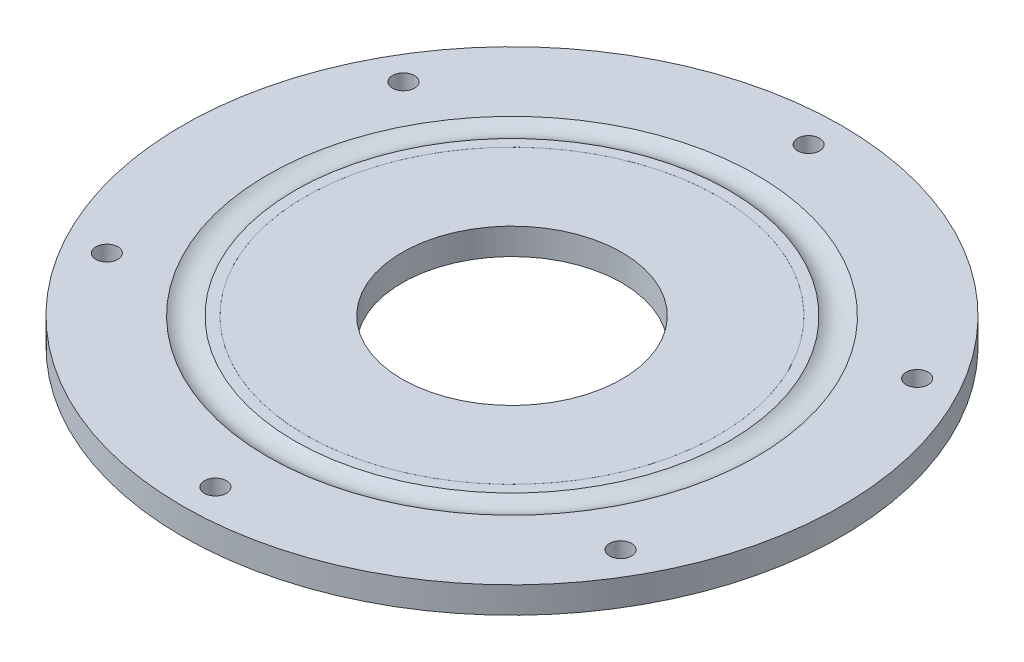
ISO-10303-21;
HEADER;
FILE_DESCRIPTION(('STEP AP214'),'2;1');
FILE_NAME('part.step','',(''),(''),'','','');
FILE_SCHEMA(('AUTOMOTIVE_DESIGN { 1 0 10303 214 1 1 1 1 }'));
ENDSEC;
DATA;
#1=APPLICATION_CONTEXT('core data for automotive mechanical design processes');
#2=APPLICATION_PROTOCOL_DEFINITION('international standard','automotive_design',2000,#1);
#3=PRODUCT_CONTEXT('',#1,'mechanical');
#4=PRODUCT('Part','Part','',(#3));
#5=PRODUCT_RELATED_PRODUCT_CATEGORY('part','',(#4));
#6=PRODUCT_DEFINITION_FORMATION('','',#4);
#7=PRODUCT_DEFINITION_CONTEXT('part definition',#1,'design');
#8=PRODUCT_DEFINITION('design','',#6,#7);
#9=PRODUCT_DEFINITION_SHAPE('','',#8);
#10=(LENGTH_UNIT() NAMED_UNIT(*) SI_UNIT(.MILLI.,.METRE.));
#11=(NAMED_UNIT(*) PLANE_ANGLE_UNIT() SI_UNIT($,.RADIAN.));
#12=(NAMED_UNIT(*) SI_UNIT($,.STERADIAN.) SOLID_ANGLE_UNIT());
#13=UNCERTAINTY_MEASURE_WITH_UNIT(LENGTH_MEASURE(1.E-05),#10,'distance_accuracy_value','');
#14=(GEOMETRIC_REPRESENTATION_CONTEXT(3) GLOBAL_UNCERTAINTY_ASSIGNED_CONTEXT((#13)) GLOBAL_UNIT_ASSIGNED_CONTEXT((#10,
#11,#12)) REPRESENTATION_CONTEXT('',''));
#15=CARTESIAN_POINT('',(0.,0.,0.));
#16=DIRECTION('',(0.,0.,1.));
#17=DIRECTION('',(1.,0.,0.));
#18=AXIS2_PLACEMENT_3D('',#15,#16,#17);
#19=CARTESIAN_POINT('',(59.,0.8724,0.));
#20=DIRECTION('',(0.,-1.,0.));
#21=DIRECTION('',(0.,0.,-1.));
#22=AXIS2_PLACEMENT_3D('',#19,#20,#21);
#23=PLANE('',#22);
#24=CARTESIAN_POINT('',(0.,0.8724,67.5));
#25=DIRECTION('',(0.,-1.,0.));
#26=DIRECTION('',(0.,0.,-1.));
#27=AXIS2_PLACEMENT_3D('',#24,#25,#26);
#28=CIRCLE('',#27,2.5);
#29=CARTESIAN_POINT('',(0.,0.8724,65.));
#30=VERTEX_POINT('',#29);
#31=EDGE_CURVE('E79',#30,#30,#28,.T.);
#32=ORIENTED_EDGE('',*,*,#31,.F.);
#33=EDGE_LOOP('',(#32));
#34=FACE_BOUND('',#33,.T.);
#35=CARTESIAN_POINT('',(-58.4567147554482,0.8724,33.7499999999975));
#36=DIRECTION('',(0.,-1.,0.));
#37=DIRECTION('',(0.,0.,-1.));
#38=AXIS2_PLACEMENT_3D('',#35,#36,#37);
#39=CIRCLE('',#38,2.50000000000347);
#40=CARTESIAN_POINT('',(-58.4567147554482,0.8724,31.249999999994));
#41=VERTEX_POINT('',#40);
#42=EDGE_CURVE('E139',#41,#41,#39,.T.);
#43=ORIENTED_EDGE('',*,*,#42,.F.);
#44=EDGE_LOOP('',(#43));
#45=FACE_BOUND('',#44,.T.);
#46=CARTESIAN_POINT('',(-58.4567147554453,0.8724,-33.7500000000025));
#47=DIRECTION('',(0.,-1.,0.));
#48=DIRECTION('',(0.,0.,-1.));
#49=AXIS2_PLACEMENT_3D('',#46,#47,#48);
#50=CIRCLE('',#49,2.50000000000682);
#51=CARTESIAN_POINT('',(-58.4567147554453,0.8724,-36.2500000000093));
#52=VERTEX_POINT('',#51);
#53=EDGE_CURVE('E143',#52,#52,#50,.T.);
#54=ORIENTED_EDGE('',*,*,#53,.F.);
#55=EDGE_LOOP('',(#54));
#56=FACE_BOUND('',#55,.T.);
#57=CARTESIAN_POINT('',(5.73059706197408E-12,0.8724,-67.5));
#58=DIRECTION('',(0.,-1.,0.));
#59=DIRECTION('',(0.,0.,-1.));
#60=AXIS2_PLACEMENT_3D('',#57,#58,#59);
#61=CIRCLE('',#60,2.50000000000717);
#62=CARTESIAN_POINT('',(5.73059706197408E-12,0.8724,-70.0000000000072));
#63=VERTEX_POINT('',#62);
#64=EDGE_CURVE('E147',#63,#63,#61,.T.);
#65=ORIENTED_EDGE('',*,*,#64,.F.);
#66=EDGE_LOOP('',(#65));
#67=FACE_BOUND('',#66,.T.);
#68=CARTESIAN_POINT('',(58.4567147554539,0.8724,-33.7499999999975));
#69=DIRECTION('',(0.,-1.,0.));
#70=DIRECTION('',(0.,0.,-1.));
#71=AXIS2_PLACEMENT_3D('',#68,#69,#70);
#72=CIRCLE('',#71,2.50000000000482);
#73=CARTESIAN_POINT('',(58.4567147554539,0.8724,-36.2500000000023));
#74=VERTEX_POINT('',#73);
#75=EDGE_CURVE('E151',#74,#74,#72,.T.);
#76=ORIENTED_EDGE('',*,*,#75,.F.);
#77=EDGE_LOOP('',(#76));
#78=FACE_BOUND('',#77,.T.);
#79=CARTESIAN_POINT('',(58.456714755451,0.8724,33.7500000000025));
#80=DIRECTION('',(0.,-1.,0.));
#81=DIRECTION('',(0.,0.,-1.));
#82=AXIS2_PLACEMENT_3D('',#79,#80,#81);
#83=CIRCLE('',#82,2.50000000000182);
#84=CARTESIAN_POINT('',(58.456714755451,0.8724,31.2500000000007));
#85=VERTEX_POINT('',#84);
#86=EDGE_CURVE('E155',#85,#85,#83,.T.);
#87=ORIENTED_EDGE('',*,*,#86,.F.);
#88=EDGE_LOOP('',(#87));
#89=FACE_BOUND('',#88,.T.);
#90=CARTESIAN_POINT('',(0.,0.8724,0.));
#91=DIRECTION('',(0.,1.,0.));
#92=DIRECTION('',(0.,0.,1.));
#93=AXIS2_PLACEMENT_3D('',#90,#91,#92);
#94=CIRCLE('',#93,47.);
#95=CARTESIAN_POINT('',(0.,0.8724,47.));
#96=VERTEX_POINT('',#95);
#97=EDGE_CURVE('E51',#96,#96,#94,.T.);
#98=ORIENTED_EDGE('',*,*,#97,.T.);
#99=EDGE_LOOP('',(#98));
#100=FACE_BOUND('',#99,.T.);
#101=CARTESIAN_POINT('',(0.,0.8724,0.));
#102=DIRECTION('',(0.,-1.,0.));
#103=DIRECTION('',(0.,0.,-1.));
#104=AXIS2_PLACEMENT_3D('',#101,#102,#103);
#105=CIRCLE('',#104,75.);
#106=CARTESIAN_POINT('',(0.,0.8724,-75.));
#107=VERTEX_POINT('',#106);
#108=EDGE_CURVE('E61',#107,#107,#105,.T.);
#109=ORIENTED_EDGE('',*,*,#108,.T.);
#110=EDGE_LOOP('',(#109));
#111=FACE_BOUND('',#110,.T.);
#112=ADVANCED_FACE('F39',(#34,#45,#56,#67,#78,#89,#100,#111),#23,.T.);
#113=CARTESIAN_POINT('',(0.,1.8724,0.));
#114=DIRECTION('',(0.,1.,0.));
#115=DIRECTION('',(0.,0.,1.));
#116=AXIS2_PLACEMENT_3D('',#113,#114,#115);
#117=TOROIDAL_SURFACE('',#116,47.,1.);
#118=CARTESIAN_POINT('',(0.,0.872424878980681,0.));
#119=DIRECTION('',(0.,1.,0.));
#120=DIRECTION('',(0.,0.,1.));
#121=AXIS2_PLACEMENT_3D('',#118,#119,#120);
#122=CIRCLE('',#121,46.9929461115406);
#123=CARTESIAN_POINT('',(0.,0.872424878980681,46.9929461115406));
#124=VERTEX_POINT('',#123);
#125=EDGE_CURVE('E11',#124,#124,#122,.F.);
#126=ORIENTED_EDGE('',*,*,#125,.F.);
#127=EDGE_LOOP('',(#126));
#128=FACE_BOUND('',#127,.T.);
#129=ORIENTED_EDGE('',*,*,#97,.F.);
#130=EDGE_LOOP('',(#129));
#131=FACE_BOUND('',#130,.T.);
#132=ADVANCED_FACE('F126',(#128,#131),#117,.T.);
#133=CARTESIAN_POINT('',(0.,5.8724,0.));
#134=DIRECTION('',(0.,1.,0.));
#135=DIRECTION('',(0.,0.,1.));
#136=AXIS2_PLACEMENT_3D('',#133,#134,#135);
#137=CONICAL_SURFACE('',#136,46.,0.785398163397353);
#138=CARTESIAN_POINT('',(0.,6.86534611154079,0.));
#139=DIRECTION('',(0.,1.,0.));
#140=DIRECTION('',(0.,0.,1.));
#141=AXIS2_PLACEMENT_3D('',#138,#139,#140);
#142=CIRCLE('',#141,46.9929461115406);
#143=CARTESIAN_POINT('',(0.,6.86534611154079,46.9929461115406));
#144=VERTEX_POINT('',#143);
#145=EDGE_CURVE('E46',#144,#144,#142,.T.);
#146=ORIENTED_EDGE('',*,*,#145,.F.);
#147=EDGE_LOOP('',(#146));
#148=FACE_BOUND('',#147,.T.);
#149=CARTESIAN_POINT('',(0.,6.87240000000019,0.));
#150=DIRECTION('',(0.,1.,0.));
#151=DIRECTION('',(0.,0.,1.));
#152=AXIS2_PLACEMENT_3D('',#149,#150,#151);
#153=CIRCLE('',#152,47.);
#154=CARTESIAN_POINT('',(0.,6.87240000000019,47.));
#155=VERTEX_POINT('',#154);
#156=EDGE_CURVE('E70',#155,#155,#153,.T.);
#157=ORIENTED_EDGE('',*,*,#156,.T.);
#158=EDGE_LOOP('',(#157));
#159=FACE_BOUND('',#158,.T.);
#160=ADVANCED_FACE('F131',(#148,#159),#137,.F.);
#161=CARTESIAN_POINT('',(47.,6.87240000000009,0.));
#162=DIRECTION('',(0.,1.,0.));
#163=DIRECTION('',(0.,0.,1.));
#164=AXIS2_PLACEMENT_3D('',#161,#162,#163);
#165=PLANE('',#164);
#166=CARTESIAN_POINT('',(0.,6.8724,0.));
#167=DIRECTION('',(0.,1.,0.));
#168=DIRECTION('',(0.,0.,1.));
#169=AXIS2_PLACEMENT_3D('',#166,#167,#168);
#170=CIRCLE('',#169,49.4043);
#171=CARTESIAN_POINT('',(0.,6.8724,49.4043));
#172=VERTEX_POINT('',#171);
#173=EDGE_CURVE('E67',#172,#172,#170,.T.);
#174=ORIENTED_EDGE('',*,*,#173,.T.);
#175=EDGE_LOOP('',(#174));
#176=FACE_BOUND('',#175,.T.);
#177=ORIENTED_EDGE('',*,*,#156,.F.);
#178=EDGE_LOOP('',(#177));
#179=FACE_BOUND('',#178,.T.);
#180=ADVANCED_FACE('F176',(#176,#179),#165,.T.);
#181=CARTESIAN_POINT('',(0.,11.,0.));
#182=DIRECTION('',(0.,1.,0.));
#183=DIRECTION('',(0.,0.,1.));
#184=AXIS2_PLACEMENT_3D('',#181,#182,#183);
#185=TOROIDAL_SURFACE('',#184,52.5,5.15950000000006);
#186=CARTESIAN_POINT('',(0.,6.87239999999989,0.));
#187=DIRECTION('',(0.,1.,0.));
#188=DIRECTION('',(0.,0.,1.));
#189=AXIS2_PLACEMENT_3D('',#186,#187,#188);
#190=CIRCLE('',#189,55.5957);
#191=CARTESIAN_POINT('',(0.,6.87239999999989,55.5957));
#192=VERTEX_POINT('',#191);
#193=EDGE_CURVE('E60',#192,#192,#190,.T.);
#194=ORIENTED_EDGE('',*,*,#193,.T.);
#195=EDGE_LOOP('',(#194));
#196=FACE_BOUND('',#195,.T.);
#197=ORIENTED_EDGE('',*,*,#173,.F.);
#198=EDGE_LOOP('',(#197));
#199=FACE_BOUND('',#198,.T.);
#200=ADVANCED_FACE('F170',(#196,#199),#185,.F.);
#201=CARTESIAN_POINT('',(55.5957,6.87239999999995,0.));
#202=DIRECTION('',(0.,1.,0.));
#203=DIRECTION('',(0.,0.,1.));
#204=AXIS2_PLACEMENT_3D('',#201,#202,#203);
#205=PLANE('',#204);
#206=CARTESIAN_POINT('',(0.,6.87239999999995,67.5));
#207=DIRECTION('',(0.,1.,0.));
#208=DIRECTION('',(0.,0.,1.));
#209=AXIS2_PLACEMENT_3D('',#206,#207,#208);
#210=CIRCLE('',#209,2.5);
#211=CARTESIAN_POINT('',(0.,6.87239999999995,70.));
#212=VERTEX_POINT('',#211);
#213=EDGE_CURVE('E42',#212,#212,#210,.T.);
#214=ORIENTED_EDGE('',*,*,#213,.F.);
#215=EDGE_LOOP('',(#214));
#216=FACE_BOUND('',#215,.T.);
#217=CARTESIAN_POINT('',(-58.4567147554482,6.87239999999995,33.7499999999975));
#218=DIRECTION('',(0.,1.,0.));
#219=DIRECTION('',(0.,0.,1.));
#220=AXIS2_PLACEMENT_3D('',#217,#218,#219);
#221=CIRCLE('',#220,2.50000000000347);
#222=CARTESIAN_POINT('',(-58.4567147554482,6.87239999999995,36.2500000000009));
#223=VERTEX_POINT('',#222);
#224=EDGE_CURVE('E87',#223,#223,#221,.T.);
#225=ORIENTED_EDGE('',*,*,#224,.F.);
#226=EDGE_LOOP('',(#225));
#227=FACE_BOUND('',#226,.T.);
#228=CARTESIAN_POINT('',(-58.4567147554453,6.87239999999995,-33.7500000000025));
#229=DIRECTION('',(0.,1.,0.));
#230=DIRECTION('',(0.,0.,1.));
#231=AXIS2_PLACEMENT_3D('',#228,#229,#230);
#232=CIRCLE('',#231,2.50000000000682);
#233=CARTESIAN_POINT('',(-58.4567147554453,6.87239999999995,-31.2499999999957));
#234=VERTEX_POINT('',#233);
#235=EDGE_CURVE('E85',#234,#234,#232,.T.);
#236=ORIENTED_EDGE('',*,*,#235,.F.);
#237=EDGE_LOOP('',(#236));
#238=FACE_BOUND('',#237,.T.);
#239=CARTESIAN_POINT('',(5.73059706197408E-12,6.87239999999995,-67.5));
#240=DIRECTION('',(0.,1.,0.));
#241=DIRECTION('',(0.,0.,1.));
#242=AXIS2_PLACEMENT_3D('',#239,#240,#241);
#243=CIRCLE('',#242,2.50000000000717);
#244=CARTESIAN_POINT('',(5.73059706197408E-12,6.87239999999995,-64.9999999999928));
#245=VERTEX_POINT('',#244);
#246=EDGE_CURVE('E82',#245,#245,#243,.T.);
#247=ORIENTED_EDGE('',*,*,#246,.F.);
#248=EDGE_LOOP('',(#247));
#249=FACE_BOUND('',#248,.T.);
#250=CARTESIAN_POINT('',(58.4567147554539,6.87239999999995,-33.7499999999975));
#251=DIRECTION('',(0.,1.,0.));
#252=DIRECTION('',(0.,0.,1.));
#253=AXIS2_PLACEMENT_3D('',#250,#251,#252);
#254=CIRCLE('',#253,2.50000000000482);
#255=CARTESIAN_POINT('',(58.4567147554539,6.87239999999995,-31.2499999999927));
#256=VERTEX_POINT('',#255);
#257=EDGE_CURVE('E78',#256,#256,#254,.T.);
#258=ORIENTED_EDGE('',*,*,#257,.F.);
#259=EDGE_LOOP('',(#258));
#260=FACE_BOUND('',#259,.T.);
#261=CARTESIAN_POINT('',(58.456714755451,6.87239999999995,33.7500000000025));
#262=DIRECTION('',(0.,1.,0.));
#263=DIRECTION('',(0.,0.,1.));
#264=AXIS2_PLACEMENT_3D('',#261,#262,#263);
#265=CIRCLE('',#264,2.50000000000182);
#266=CARTESIAN_POINT('',(58.456714755451,6.87239999999995,36.2500000000043));
#267=VERTEX_POINT('',#266);
#268=EDGE_CURVE('E75',#267,#267,#265,.T.);
#269=ORIENTED_EDGE('',*,*,#268,.F.);
#270=EDGE_LOOP('',(#269));
#271=FACE_BOUND('',#270,.T.);
#272=ORIENTED_EDGE('',*,*,#193,.F.);
#273=EDGE_LOOP('',(#272));
#274=FACE_BOUND('',#273,.T.);
#275=CARTESIAN_POINT('',(0.,6.8724,0.));
#276=DIRECTION('',(0.,-1.,0.));
#277=DIRECTION('',(0.,0.,-1.));
#278=AXIS2_PLACEMENT_3D('',#275,#276,#277);
#279=CIRCLE('',#278,75.);
#280=CARTESIAN_POINT('',(0.,6.8724,-75.));
#281=VERTEX_POINT('',#280);
#282=EDGE_CURVE('E57',#281,#281,#279,.T.);
#283=ORIENTED_EDGE('',*,*,#282,.F.);
#284=EDGE_LOOP('',(#283));
#285=FACE_BOUND('',#284,.T.);
#286=ADVANCED_FACE('F162',(#216,#227,#238,#249,#260,#271,#274,#285),#205,.T.);
#287=CARTESIAN_POINT('',(0.,6.8724,0.));
#288=DIRECTION('',(0.,-1.,0.));
#289=DIRECTION('',(0.,0.,-1.));
#290=AXIS2_PLACEMENT_3D('',#287,#288,#289);
#291=CYLINDRICAL_SURFACE('',#290,75.);
#292=ORIENTED_EDGE('',*,*,#282,.T.);
#293=EDGE_LOOP('',(#292));
#294=FACE_BOUND('',#293,.T.);
#295=ORIENTED_EDGE('',*,*,#108,.F.);
#296=EDGE_LOOP('',(#295));
#297=FACE_BOUND('',#296,.T.);
#298=ADVANCED_FACE('F160',(#294,#297),#291,.T.);
#299=CARTESIAN_POINT('',(0.,6.8724,0.));
#300=DIRECTION('',(0.,-1.,0.));
#301=DIRECTION('',(0.,0.,-1.));
#302=AXIS2_PLACEMENT_3D('',#299,#300,#301);
#303=PLANE('',#302);
#304=CARTESIAN_POINT('',(0.,6.8724,0.));
#305=DIRECTION('',(0.,1.,0.));
#306=DIRECTION('',(0.,0.,1.));
#307=AXIS2_PLACEMENT_3D('',#304,#305,#306);
#308=CIRCLE('',#307,25.);
#309=CARTESIAN_POINT('',(0.,6.8724,25.));
#310=VERTEX_POINT('',#309);
#311=EDGE_CURVE('E92',#310,#310,#308,.T.);
#312=ORIENTED_EDGE('',*,*,#311,.F.);
#313=EDGE_LOOP('',(#312));
#314=FACE_BOUND('',#313,.T.);
#315=CARTESIAN_POINT('',(0.,6.8724,0.));
#316=DIRECTION('',(0.,-1.,0.));
#317=DIRECTION('',(0.,0.,-1.));
#318=AXIS2_PLACEMENT_3D('',#315,#316,#317);
#319=CIRCLE('',#318,46.9929461115406);
#320=CARTESIAN_POINT('',(0.,6.8724,-46.9929461115406));
#321=VERTEX_POINT('',#320);
#322=EDGE_CURVE('E64',#321,#321,#319,.T.);
#323=ORIENTED_EDGE('',*,*,#322,.F.);
#324=EDGE_LOOP('',(#323));
#325=FACE_BOUND('',#324,.T.);
#326=ADVANCED_FACE('F122',(#314,#325),#303,.F.);
#327=CARTESIAN_POINT('',(0.,6.8724,0.));
#328=DIRECTION('',(0.,-1.,0.));
#329=DIRECTION('',(0.,0.,-1.));
#330=AXIS2_PLACEMENT_3D('',#327,#328,#329);
#331=CYLINDRICAL_SURFACE('',#330,46.9929461115406);
#332=ORIENTED_EDGE('',*,*,#145,.T.);
#333=EDGE_LOOP('',(#332));
#334=FACE_BOUND('',#333,.T.);
#335=ORIENTED_EDGE('',*,*,#322,.T.);
#336=EDGE_LOOP('',(#335));
#337=FACE_BOUND('',#336,.T.);
#338=ADVANCED_FACE('F113',(#334,#337),#331,.T.);
#339=ORIENTED_EDGE('',*,*,#125,.T.);
#340=EDGE_LOOP('',(#339));
#341=FACE_BOUND('',#340,.T.);
#342=CARTESIAN_POINT('',(0.,0.8724,0.));
#343=DIRECTION('',(0.,-1.,0.));
#344=DIRECTION('',(0.,0.,-1.));
#345=AXIS2_PLACEMENT_3D('',#342,#343,#344);
#346=CIRCLE('',#345,46.9929461115406);
#347=CARTESIAN_POINT('',(0.,0.8724,-46.9929461115406));
#348=VERTEX_POINT('',#347);
#349=EDGE_CURVE('E55',#348,#348,#346,.T.);
#350=ORIENTED_EDGE('',*,*,#349,.F.);
#351=EDGE_LOOP('',(#350));
#352=FACE_BOUND('',#351,.T.);
#353=ADVANCED_FACE('F111',(#341,#352),#331,.T.);
#354=CARTESIAN_POINT('',(0.,0.8724,0.));
#355=DIRECTION('',(0.,-1.,0.));
#356=DIRECTION('',(0.,0.,-1.));
#357=AXIS2_PLACEMENT_3D('',#354,#355,#356);
#358=PLANE('',#357);
#359=CARTESIAN_POINT('',(0.,0.872400000000001,0.));
#360=DIRECTION('',(0.,1.,0.));
#361=DIRECTION('',(0.,0.,1.));
#362=AXIS2_PLACEMENT_3D('',#359,#360,#361);
#363=CIRCLE('',#362,25.);
#364=CARTESIAN_POINT('',(0.,0.872400000000001,25.));
#365=VERTEX_POINT('',#364);
#366=EDGE_CURVE('E96',#365,#365,#363,.T.);
#367=ORIENTED_EDGE('',*,*,#366,.T.);
#368=EDGE_LOOP('',(#367));
#369=FACE_BOUND('',#368,.T.);
#370=ORIENTED_EDGE('',*,*,#349,.T.);
#371=EDGE_LOOP('',(#370));
#372=FACE_BOUND('',#371,.T.);
#373=ADVANCED_FACE('F109',(#369,#372),#358,.T.);
#374=CARTESIAN_POINT('',(0.,0.872400000000001,0.));
#375=DIRECTION('',(0.,1.,0.));
#376=DIRECTION('',(0.,0.,1.));
#377=AXIS2_PLACEMENT_3D('',#374,#375,#376);
#378=CYLINDRICAL_SURFACE('',#377,25.);
#379=ORIENTED_EDGE('',*,*,#366,.F.);
#380=EDGE_LOOP('',(#379));
#381=FACE_BOUND('',#380,.T.);
#382=ORIENTED_EDGE('',*,*,#311,.T.);
#383=EDGE_LOOP('',(#382));
#384=FACE_BOUND('',#383,.T.);
#385=ADVANCED_FACE('F119',(#381,#384),#378,.F.);
#386=CARTESIAN_POINT('',(58.456714755451,10.8724,33.7500000000025));
#387=DIRECTION('',(0.,-1.,0.));
#388=DIRECTION('',(0.,0.,-1.));
#389=AXIS2_PLACEMENT_3D('',#386,#387,#388);
#390=CYLINDRICAL_SURFACE('',#389,2.50000000000182);
#391=ORIENTED_EDGE('',*,*,#268,.T.);
#392=EDGE_LOOP('',(#391));
#393=FACE_BOUND('',#392,.T.);
#394=ORIENTED_EDGE('',*,*,#86,.T.);
#395=EDGE_LOOP('',(#394));
#396=FACE_BOUND('',#395,.T.);
#397=ADVANCED_FACE('F213',(#393,#396),#390,.F.);
#398=CARTESIAN_POINT('',(58.4567147554539,10.8724,-33.7499999999975));
#399=DIRECTION('',(0.,-1.,0.));
#400=DIRECTION('',(0.,0.,-1.));
#401=AXIS2_PLACEMENT_3D('',#398,#399,#400);
#402=CYLINDRICAL_SURFACE('',#401,2.50000000000482);
#403=ORIENTED_EDGE('',*,*,#257,.T.);
#404=EDGE_LOOP('',(#403));
#405=FACE_BOUND('',#404,.T.);
#406=ORIENTED_EDGE('',*,*,#75,.T.);
#407=EDGE_LOOP('',(#406));
#408=FACE_BOUND('',#407,.T.);
#409=ADVANCED_FACE('F218',(#405,#408),#402,.F.);
#410=CARTESIAN_POINT('',(5.73059706197408E-12,10.8724,-67.5));
#411=DIRECTION('',(0.,-1.,0.));
#412=DIRECTION('',(0.,0.,-1.));
#413=AXIS2_PLACEMENT_3D('',#410,#411,#412);
#414=CYLINDRICAL_SURFACE('',#413,2.50000000000717);
#415=ORIENTED_EDGE('',*,*,#246,.T.);
#416=EDGE_LOOP('',(#415));
#417=FACE_BOUND('',#416,.T.);
#418=ORIENTED_EDGE('',*,*,#64,.T.);
#419=EDGE_LOOP('',(#418));
#420=FACE_BOUND('',#419,.T.);
#421=ADVANCED_FACE('F230',(#417,#420),#414,.F.);
#422=CARTESIAN_POINT('',(-58.4567147554453,10.8724,-33.7500000000025));
#423=DIRECTION('',(0.,-1.,0.));
#424=DIRECTION('',(0.,0.,-1.));
#425=AXIS2_PLACEMENT_3D('',#422,#423,#424);
#426=CYLINDRICAL_SURFACE('',#425,2.50000000000682);
#427=ORIENTED_EDGE('',*,*,#235,.T.);
#428=EDGE_LOOP('',(#427));
#429=FACE_BOUND('',#428,.T.);
#430=ORIENTED_EDGE('',*,*,#53,.T.);
#431=EDGE_LOOP('',(#430));
#432=FACE_BOUND('',#431,.T.);
#433=ADVANCED_FACE('F240',(#429,#432),#426,.F.);
#434=CARTESIAN_POINT('',(-58.4567147554482,10.8724,33.7499999999975));
#435=DIRECTION('',(0.,-1.,0.));
#436=DIRECTION('',(0.,0.,-1.));
#437=AXIS2_PLACEMENT_3D('',#434,#435,#436);
#438=CYLINDRICAL_SURFACE('',#437,2.50000000000347);
#439=ORIENTED_EDGE('',*,*,#224,.T.);
#440=EDGE_LOOP('',(#439));
#441=FACE_BOUND('',#440,.T.);
#442=ORIENTED_EDGE('',*,*,#42,.T.);
#443=EDGE_LOOP('',(#442));
#444=FACE_BOUND('',#443,.T.);
#445=ADVANCED_FACE('F250',(#441,#444),#438,.F.);
#446=CARTESIAN_POINT('',(0.,10.8724,67.5));
#447=DIRECTION('',(0.,-1.,0.));
#448=DIRECTION('',(0.,0.,-1.));
#449=AXIS2_PLACEMENT_3D('',#446,#447,#448);
#450=CYLINDRICAL_SURFACE('',#449,2.5);
#451=ORIENTED_EDGE('',*,*,#213,.T.);
#452=EDGE_LOOP('',(#451));
#453=FACE_BOUND('',#452,.T.);
#454=ORIENTED_EDGE('',*,*,#31,.T.);
#455=EDGE_LOOP('',(#454));
#456=FACE_BOUND('',#455,.T.);
#457=ADVANCED_FACE('F260',(#453,#456),#450,.F.);
#458=CLOSED_SHELL('',(#112,#132,#160,#180,#200,#286,#298,#326,#338,#353,#373,#385,#397,#409,
#421,#433,#445,#457));
#459=MANIFOLD_SOLID_BREP('B2',#458);
#460=ADVANCED_BREP_SHAPE_REPRESENTATION('',(#18,#459),#14);
#461=SHAPE_DEFINITION_REPRESENTATION(#9,#460);
ENDSEC;
END-ISO-10303-21;
